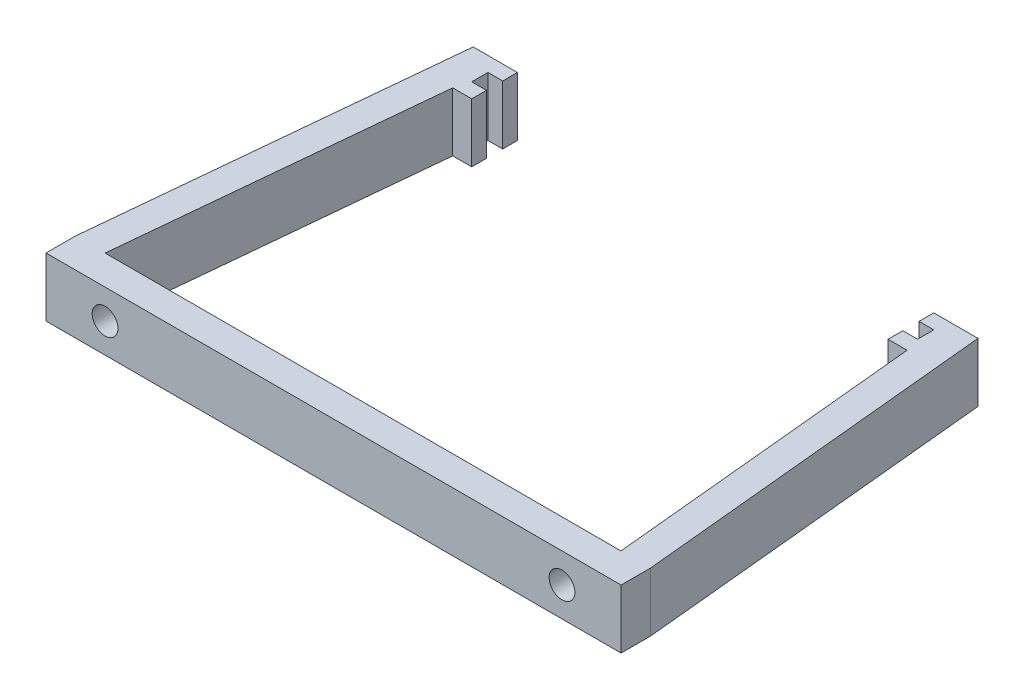
ISO-10303-21;
HEADER;
FILE_DESCRIPTION(('STEP AP214'),'2;1');
FILE_NAME('part.step','',(''),(''),'','','');
FILE_SCHEMA(('AUTOMOTIVE_DESIGN { 1 0 10303 214 1 1 1 1 }'));
ENDSEC;
DATA;
#1=APPLICATION_CONTEXT('core data for automotive mechanical design processes');
#2=APPLICATION_PROTOCOL_DEFINITION('international standard','automotive_design',2000,#1);
#3=PRODUCT_CONTEXT('',#1,'mechanical');
#4=PRODUCT('Part','Part','',(#3));
#5=PRODUCT_RELATED_PRODUCT_CATEGORY('part','',(#4));
#6=PRODUCT_DEFINITION_FORMATION('','',#4);
#7=PRODUCT_DEFINITION_CONTEXT('part definition',#1,'design');
#8=PRODUCT_DEFINITION('design','',#6,#7);
#9=PRODUCT_DEFINITION_SHAPE('','',#8);
#10=(LENGTH_UNIT() NAMED_UNIT(*) SI_UNIT(.MILLI.,.METRE.));
#11=(NAMED_UNIT(*) PLANE_ANGLE_UNIT() SI_UNIT($,.RADIAN.));
#12=(NAMED_UNIT(*) SI_UNIT($,.STERADIAN.) SOLID_ANGLE_UNIT());
#13=UNCERTAINTY_MEASURE_WITH_UNIT(LENGTH_MEASURE(1.E-05),#10,'distance_accuracy_value','');
#14=(GEOMETRIC_REPRESENTATION_CONTEXT(3) GLOBAL_UNCERTAINTY_ASSIGNED_CONTEXT((#13)) GLOBAL_UNIT_ASSIGNED_CONTEXT((#10,
#11,#12)) REPRESENTATION_CONTEXT('',''));
#15=CARTESIAN_POINT('',(0.,0.,0.));
#16=DIRECTION('',(0.,0.,1.));
#17=DIRECTION('',(1.,0.,0.));
#18=AXIS2_PLACEMENT_3D('',#15,#16,#17);
#19=CARTESIAN_POINT('',(0.,0.,4.));
#20=DIRECTION('',(0.,0.,1.));
#21=DIRECTION('',(1.,0.,0.));
#22=AXIS2_PLACEMENT_3D('',#19,#20,#21);
#23=PLANE('',#22);
#24=CARTESIAN_POINT('',(-31.,0.,4.));
#25=DIRECTION('',(0.,0.,1.));
#26=DIRECTION('',(1.,0.,0.));
#27=AXIS2_PLACEMENT_3D('',#24,#25,#26);
#28=CIRCLE('',#27,1.75);
#29=CARTESIAN_POINT('',(-29.25,0.,4.));
#30=VERTEX_POINT('',#29);
#31=EDGE_CURVE('E330',#30,#30,#28,.T.);
#32=ORIENTED_EDGE('',*,*,#31,.F.);
#33=EDGE_LOOP('',(#32));
#34=FACE_BOUND('',#33,.T.);
#35=DIRECTION('',(1.,0.,0.));
#36=VECTOR('',#35,1.);
#37=CARTESIAN_POINT('',(-35.,-4.,4.));
#38=LINE('',#37,#36);
#39=CARTESIAN_POINT('',(-39.0187452660254,-4.,4.));
#40=VERTEX_POINT('',#39);
#41=CARTESIAN_POINT('',(39.0187452660254,-4.,3.99999999999999));
#42=VERTEX_POINT('',#41);
#43=EDGE_CURVE('E11',#40,#42,#38,.T.);
#44=ORIENTED_EDGE('',*,*,#43,.T.);
#45=DIRECTION('',(0.,1.,0.));
#46=VECTOR('',#45,1.);
#47=CARTESIAN_POINT('',(39.0187452660254,-58.2789634628789,3.99999999999999));
#48=LINE('',#47,#46);
#49=CARTESIAN_POINT('',(39.0187452660254,4.,3.99999999999999));
#50=VERTEX_POINT('',#49);
#51=EDGE_CURVE('E233',#42,#50,#48,.T.);
#52=ORIENTED_EDGE('',*,*,#51,.T.);
#53=DIRECTION('',(-1.,0.,0.));
#54=VECTOR('',#53,1.);
#55=CARTESIAN_POINT('',(-35.,4.,4.));
#56=LINE('',#55,#54);
#57=CARTESIAN_POINT('',(-39.0187452660254,4.,4.));
#58=VERTEX_POINT('',#57);
#59=EDGE_CURVE('E41',#50,#58,#56,.T.);
#60=ORIENTED_EDGE('',*,*,#59,.T.);
#61=DIRECTION('',(0.,1.,0.));
#62=VECTOR('',#61,1.);
#63=CARTESIAN_POINT('',(-39.0187452660254,-58.2789634628789,4.));
#64=LINE('',#63,#62);
#65=EDGE_CURVE('E257',#40,#58,#64,.T.);
#66=ORIENTED_EDGE('',*,*,#65,.F.);
#67=EDGE_LOOP('',(#44,#52,#60,#66));
#68=FACE_BOUND('',#67,.T.);
#69=CARTESIAN_POINT('',(31.,0.,4.));
#70=DIRECTION('',(0.,0.,1.));
#71=DIRECTION('',(1.,0.,0.));
#72=AXIS2_PLACEMENT_3D('',#69,#70,#71);
#73=CIRCLE('',#72,1.75);
#74=CARTESIAN_POINT('',(32.75,0.,4.));
#75=VERTEX_POINT('',#74);
#76=EDGE_CURVE('E324',#75,#75,#73,.T.);
#77=ORIENTED_EDGE('',*,*,#76,.F.);
#78=EDGE_LOOP('',(#77));
#79=FACE_BOUND('',#78,.T.);
#80=ADVANCED_FACE('F32',(#34,#68,#79),#23,.T.);
#81=CARTESIAN_POINT('',(0.,0.,0.));
#82=DIRECTION('',(0.,0.,1.));
#83=DIRECTION('',(1.,0.,0.));
#84=AXIS2_PLACEMENT_3D('',#81,#82,#83);
#85=PLANE('',#84);
#86=DIRECTION('',(0.,1.,0.));
#87=VECTOR('',#86,1.);
#88=CARTESIAN_POINT('',(35.,4.,0.));
#89=LINE('',#88,#87);
#90=CARTESIAN_POINT('',(35.,-4.,0.));
#91=VERTEX_POINT('',#90);
#92=CARTESIAN_POINT('',(35.,4.,0.));
#93=VERTEX_POINT('',#92);
#94=EDGE_CURVE('E333',#91,#93,#89,.T.);
#95=ORIENTED_EDGE('',*,*,#94,.F.);
#96=DIRECTION('',(1.,0.,0.));
#97=VECTOR('',#96,1.);
#98=CARTESIAN_POINT('',(-35.,-4.,0.));
#99=LINE('',#98,#97);
#100=CARTESIAN_POINT('',(-35.,-4.,0.));
#101=VERTEX_POINT('',#100);
#102=EDGE_CURVE('E36',#101,#91,#99,.T.);
#103=ORIENTED_EDGE('',*,*,#102,.F.);
#104=DIRECTION('',(0.,-1.,0.));
#105=VECTOR('',#104,1.);
#106=CARTESIAN_POINT('',(-35.,4.,0.));
#107=LINE('',#106,#105);
#108=CARTESIAN_POINT('',(-35.,4.,0.));
#109=VERTEX_POINT('',#108);
#110=EDGE_CURVE('E49',#109,#101,#107,.T.);
#111=ORIENTED_EDGE('',*,*,#110,.F.);
#112=DIRECTION('',(-1.,0.,0.));
#113=VECTOR('',#112,1.);
#114=CARTESIAN_POINT('',(-35.,4.,0.));
#115=LINE('',#114,#113);
#116=EDGE_CURVE('E56',#93,#109,#115,.T.);
#117=ORIENTED_EDGE('',*,*,#116,.F.);
#118=EDGE_LOOP('',(#95,#103,#111,#117));
#119=FACE_BOUND('',#118,.T.);
#120=CARTESIAN_POINT('',(-31.,0.,0.));
#121=DIRECTION('',(0.,0.,1.));
#122=DIRECTION('',(1.,0.,0.));
#123=AXIS2_PLACEMENT_3D('',#120,#121,#122);
#124=CIRCLE('',#123,1.75);
#125=CARTESIAN_POINT('',(-29.25,0.,0.));
#126=VERTEX_POINT('',#125);
#127=EDGE_CURVE('E327',#126,#126,#124,.T.);
#128=ORIENTED_EDGE('',*,*,#127,.T.);
#129=EDGE_LOOP('',(#128));
#130=FACE_BOUND('',#129,.T.);
#131=CARTESIAN_POINT('',(31.,0.,0.));
#132=DIRECTION('',(0.,0.,1.));
#133=DIRECTION('',(1.,0.,0.));
#134=AXIS2_PLACEMENT_3D('',#131,#132,#133);
#135=CIRCLE('',#134,1.75);
#136=CARTESIAN_POINT('',(32.75,0.,0.));
#137=VERTEX_POINT('',#136);
#138=EDGE_CURVE('E323',#137,#137,#135,.T.);
#139=ORIENTED_EDGE('',*,*,#138,.T.);
#140=EDGE_LOOP('',(#139));
#141=FACE_BOUND('',#140,.T.);
#142=ADVANCED_FACE('F394',(#119,#130,#141),#85,.F.);
#143=CARTESIAN_POINT('',(-35.,4.,4.));
#144=DIRECTION('',(0.,-1.,0.));
#145=DIRECTION('',(0.,0.,-1.));
#146=AXIS2_PLACEMENT_3D('',#143,#144,#145);
#147=PLANE('',#146);
#148=ORIENTED_EDGE('',*,*,#116,.T.);
#149=DIRECTION('',(0.0964736109138817,0.,-0.995335542617281));
#150=VECTOR('',#149,1.);
#151=CARTESIAN_POINT('',(-30.8321941780672,4.,-43.));
#152=LINE('',#151,#150);
#153=CARTESIAN_POINT('',(-30.8321941780672,4.,-43.));
#154=VERTEX_POINT('',#153);
#155=EDGE_CURVE('E253',#109,#154,#152,.T.);
#156=ORIENTED_EDGE('',*,*,#155,.T.);
#157=DIRECTION('',(1.,0.,0.));
#158=VECTOR('',#157,1.);
#159=CARTESIAN_POINT('',(-28.25,4.,-43.));
#160=LINE('',#159,#158);
#161=CARTESIAN_POINT('',(-28.25,4.,-43.));
#162=VERTEX_POINT('',#161);
#163=EDGE_CURVE('E276',#154,#162,#160,.T.);
#164=ORIENTED_EDGE('',*,*,#163,.T.);
#165=DIRECTION('',(0.,0.,-1.));
#166=VECTOR('',#165,1.);
#167=CARTESIAN_POINT('',(-28.25,4.,-45.));
#168=LINE('',#167,#166);
#169=CARTESIAN_POINT('',(-28.25,4.,-45.));
#170=VERTEX_POINT('',#169);
#171=EDGE_CURVE('E279',#162,#170,#168,.T.);
#172=ORIENTED_EDGE('',*,*,#171,.T.);
#173=DIRECTION('',(-1.,0.,0.));
#174=VECTOR('',#173,1.);
#175=CARTESIAN_POINT('',(-30.25,4.,-45.));
#176=LINE('',#175,#174);
#177=CARTESIAN_POINT('',(-30.25,4.,-45.));
#178=VERTEX_POINT('',#177);
#179=EDGE_CURVE('E282',#170,#178,#176,.T.);
#180=ORIENTED_EDGE('',*,*,#179,.T.);
#181=DIRECTION('',(0.,0.,-1.));
#182=VECTOR('',#181,1.);
#183=CARTESIAN_POINT('',(-30.25,4.,-47.2));
#184=LINE('',#183,#182);
#185=CARTESIAN_POINT('',(-30.25,4.,-47.2));
#186=VERTEX_POINT('',#185);
#187=EDGE_CURVE('E285',#178,#186,#184,.T.);
#188=ORIENTED_EDGE('',*,*,#187,.T.);
#189=DIRECTION('',(1.,0.,0.));
#190=VECTOR('',#189,1.);
#191=CARTESIAN_POINT('',(-28.25,4.,-47.2));
#192=LINE('',#191,#190);
#193=CARTESIAN_POINT('',(-28.25,4.,-47.2));
#194=VERTEX_POINT('',#193);
#195=EDGE_CURVE('E288',#186,#194,#192,.T.);
#196=ORIENTED_EDGE('',*,*,#195,.T.);
#197=DIRECTION('',(0.,0.,-1.));
#198=VECTOR('',#197,1.);
#199=CARTESIAN_POINT('',(-28.25,4.,-49.2));
#200=LINE('',#199,#198);
#201=CARTESIAN_POINT('',(-28.25,4.,-49.2));
#202=VERTEX_POINT('',#201);
#203=EDGE_CURVE('E291',#194,#202,#200,.T.);
#204=ORIENTED_EDGE('',*,*,#203,.T.);
#205=DIRECTION('',(-1.,0.,0.));
#206=VECTOR('',#205,1.);
#207=CARTESIAN_POINT('',(-34.25,4.,-49.1999999999999));
#208=LINE('',#207,#206);
#209=CARTESIAN_POINT('',(-34.25,4.,-49.1999999999999));
#210=VERTEX_POINT('',#209);
#211=EDGE_CURVE('E294',#202,#210,#208,.T.);
#212=ORIENTED_EDGE('',*,*,#211,.T.);
#213=DIRECTION('',(-0.0964736109138816,0.,0.995335542617281));
#214=VECTOR('',#213,1.);
#215=CARTESIAN_POINT('',(-39.0187452660254,4.,0.));
#216=LINE('',#215,#214);
#217=CARTESIAN_POINT('',(-39.0187452660254,4.,0.));
#218=VERTEX_POINT('',#217);
#219=EDGE_CURVE('E297',#210,#218,#216,.T.);
#220=ORIENTED_EDGE('',*,*,#219,.T.);
#221=DIRECTION('',(0.,0.,1.));
#222=VECTOR('',#221,1.);
#223=CARTESIAN_POINT('',(-39.0187452660254,4.,0.));
#224=LINE('',#223,#222);
#225=EDGE_CURVE('E300',#218,#58,#224,.T.);
#226=ORIENTED_EDGE('',*,*,#225,.T.);
#227=ORIENTED_EDGE('',*,*,#59,.F.);
#228=DIRECTION('',(0.,0.,-1.));
#229=VECTOR('',#228,1.);
#230=CARTESIAN_POINT('',(39.0187452660254,4.,0.));
#231=LINE('',#230,#229);
#232=CARTESIAN_POINT('',(39.0187452660254,4.,0.));
#233=VERTEX_POINT('',#232);
#234=EDGE_CURVE('E189',#50,#233,#231,.T.);
#235=ORIENTED_EDGE('',*,*,#234,.T.);
#236=DIRECTION('',(-0.0964736109138818,0.,-0.995335542617281));
#237=VECTOR('',#236,1.);
#238=CARTESIAN_POINT('',(39.0187452660254,4.,0.));
#239=LINE('',#238,#237);
#240=CARTESIAN_POINT('',(34.25,4.,-49.2));
#241=VERTEX_POINT('',#240);
#242=EDGE_CURVE('E198',#233,#241,#239,.T.);
#243=ORIENTED_EDGE('',*,*,#242,.T.);
#244=DIRECTION('',(-1.,0.,0.));
#245=VECTOR('',#244,1.);
#246=CARTESIAN_POINT('',(34.25,4.,-49.2));
#247=LINE('',#246,#245);
#248=CARTESIAN_POINT('',(28.25,4.,-49.2));
#249=VERTEX_POINT('',#248);
#250=EDGE_CURVE('E204',#241,#249,#247,.T.);
#251=ORIENTED_EDGE('',*,*,#250,.T.);
#252=DIRECTION('',(0.,0.,1.));
#253=VECTOR('',#252,1.);
#254=CARTESIAN_POINT('',(28.25,4.,-49.2));
#255=LINE('',#254,#253);
#256=CARTESIAN_POINT('',(28.25,4.,-47.2));
#257=VERTEX_POINT('',#256);
#258=EDGE_CURVE('E213',#249,#257,#255,.T.);
#259=ORIENTED_EDGE('',*,*,#258,.T.);
#260=DIRECTION('',(1.,0.,0.));
#261=VECTOR('',#260,1.);
#262=CARTESIAN_POINT('',(28.25,4.,-47.2));
#263=LINE('',#262,#261);
#264=CARTESIAN_POINT('',(30.25,4.,-47.2));
#265=VERTEX_POINT('',#264);
#266=EDGE_CURVE('E216',#257,#265,#263,.T.);
#267=ORIENTED_EDGE('',*,*,#266,.T.);
#268=DIRECTION('',(0.,0.,1.));
#269=VECTOR('',#268,1.);
#270=CARTESIAN_POINT('',(30.25,4.,-47.2));
#271=LINE('',#270,#269);
#272=CARTESIAN_POINT('',(30.25,4.,-45.));
#273=VERTEX_POINT('',#272);
#274=EDGE_CURVE('E219',#265,#273,#271,.T.);
#275=ORIENTED_EDGE('',*,*,#274,.T.);
#276=DIRECTION('',(-1.,0.,0.));
#277=VECTOR('',#276,1.);
#278=CARTESIAN_POINT('',(30.25,4.,-45.));
#279=LINE('',#278,#277);
#280=CARTESIAN_POINT('',(28.25,4.,-45.));
#281=VERTEX_POINT('',#280);
#282=EDGE_CURVE('E222',#273,#281,#279,.T.);
#283=ORIENTED_EDGE('',*,*,#282,.T.);
#284=DIRECTION('',(0.,0.,1.));
#285=VECTOR('',#284,1.);
#286=CARTESIAN_POINT('',(28.25,4.,-45.));
#287=LINE('',#286,#285);
#288=CARTESIAN_POINT('',(28.25,4.,-43.));
#289=VERTEX_POINT('',#288);
#290=EDGE_CURVE('E225',#281,#289,#287,.T.);
#291=ORIENTED_EDGE('',*,*,#290,.T.);
#292=DIRECTION('',(1.,0.,0.));
#293=VECTOR('',#292,1.);
#294=CARTESIAN_POINT('',(28.25,4.,-43.));
#295=LINE('',#294,#293);
#296=CARTESIAN_POINT('',(30.8321941780672,4.,-43.));
#297=VERTEX_POINT('',#296);
#298=EDGE_CURVE('E228',#289,#297,#295,.T.);
#299=ORIENTED_EDGE('',*,*,#298,.T.);
#300=DIRECTION('',(0.0964736109138817,0.,0.995335542617281));
#301=VECTOR('',#300,1.);
#302=CARTESIAN_POINT('',(30.8321941780672,4.,-43.));
#303=LINE('',#302,#301);
#304=EDGE_CURVE('E195',#297,#93,#303,.T.);
#305=ORIENTED_EDGE('',*,*,#304,.T.);
#306=EDGE_LOOP('',(#148,#156,#164,#172,#180,#188,#196,#204,#212,#220,#226,#227,#235,#243,#251,
#259,#267,#275,#283,#291,#299,#305));
#307=FACE_BOUND('',#306,.T.);
#308=ADVANCED_FACE('F34',(#307),#147,.F.);
#309=CARTESIAN_POINT('',(-35.,-4.,4.));
#310=DIRECTION('',(0.,1.,0.));
#311=DIRECTION('',(0.,0.,1.));
#312=AXIS2_PLACEMENT_3D('',#309,#310,#311);
#313=PLANE('',#312);
#314=ORIENTED_EDGE('',*,*,#102,.T.);
#315=DIRECTION('',(-0.0964736109138817,0.,-0.995335542617281));
#316=VECTOR('',#315,1.);
#317=CARTESIAN_POINT('',(30.8321941780672,-4.,-43.));
#318=LINE('',#317,#316);
#319=CARTESIAN_POINT('',(30.8321941780672,-4.,-43.));
#320=VERTEX_POINT('',#319);
#321=EDGE_CURVE('E343',#91,#320,#318,.T.);
#322=ORIENTED_EDGE('',*,*,#321,.T.);
#323=DIRECTION('',(-1.,0.,0.));
#324=VECTOR('',#323,1.);
#325=CARTESIAN_POINT('',(28.25,-4.,-43.));
#326=LINE('',#325,#324);
#327=CARTESIAN_POINT('',(28.25,-4.,-43.));
#328=VERTEX_POINT('',#327);
#329=EDGE_CURVE('E349',#320,#328,#326,.T.);
#330=ORIENTED_EDGE('',*,*,#329,.T.);
#331=DIRECTION('',(0.,0.,-1.));
#332=VECTOR('',#331,1.);
#333=CARTESIAN_POINT('',(28.25,-4.,-45.));
#334=LINE('',#333,#332);
#335=CARTESIAN_POINT('',(28.25,-4.,-45.));
#336=VERTEX_POINT('',#335);
#337=EDGE_CURVE('E350',#328,#336,#334,.T.);
#338=ORIENTED_EDGE('',*,*,#337,.T.);
#339=DIRECTION('',(1.,0.,0.));
#340=VECTOR('',#339,1.);
#341=CARTESIAN_POINT('',(30.25,-4.,-45.));
#342=LINE('',#341,#340);
#343=CARTESIAN_POINT('',(30.25,-4.,-45.));
#344=VERTEX_POINT('',#343);
#345=EDGE_CURVE('E354',#336,#344,#342,.T.);
#346=ORIENTED_EDGE('',*,*,#345,.T.);
#347=DIRECTION('',(0.,0.,-1.));
#348=VECTOR('',#347,1.);
#349=CARTESIAN_POINT('',(30.25,-4.,-47.2));
#350=LINE('',#349,#348);
#351=CARTESIAN_POINT('',(30.25,-4.,-47.2));
#352=VERTEX_POINT('',#351);
#353=EDGE_CURVE('E356',#344,#352,#350,.T.);
#354=ORIENTED_EDGE('',*,*,#353,.T.);
#355=DIRECTION('',(-1.,0.,0.));
#356=VECTOR('',#355,1.);
#357=CARTESIAN_POINT('',(28.25,-4.,-47.2));
#358=LINE('',#357,#356);
#359=CARTESIAN_POINT('',(28.25,-4.,-47.2));
#360=VERTEX_POINT('',#359);
#361=EDGE_CURVE('E358',#352,#360,#358,.T.);
#362=ORIENTED_EDGE('',*,*,#361,.T.);
#363=DIRECTION('',(0.,0.,-1.));
#364=VECTOR('',#363,1.);
#365=CARTESIAN_POINT('',(28.25,-4.,-49.2));
#366=LINE('',#365,#364);
#367=CARTESIAN_POINT('',(28.25,-4.,-49.2));
#368=VERTEX_POINT('',#367);
#369=EDGE_CURVE('E360',#360,#368,#366,.T.);
#370=ORIENTED_EDGE('',*,*,#369,.T.);
#371=DIRECTION('',(1.,0.,0.));
#372=VECTOR('',#371,1.);
#373=CARTESIAN_POINT('',(34.25,-4.,-49.2));
#374=LINE('',#373,#372);
#375=CARTESIAN_POINT('',(34.25,-4.,-49.2));
#376=VERTEX_POINT('',#375);
#377=EDGE_CURVE('E235',#368,#376,#374,.T.);
#378=ORIENTED_EDGE('',*,*,#377,.T.);
#379=DIRECTION('',(0.0964736109138819,0.,0.995335542617281));
#380=VECTOR('',#379,1.);
#381=CARTESIAN_POINT('',(39.0187452660254,-4.,0.));
#382=LINE('',#381,#380);
#383=CARTESIAN_POINT('',(39.0187452660254,-4.,0.));
#384=VERTEX_POINT('',#383);
#385=EDGE_CURVE('E251',#376,#384,#382,.T.);
#386=ORIENTED_EDGE('',*,*,#385,.T.);
#387=DIRECTION('',(0.,0.,1.));
#388=VECTOR('',#387,1.);
#389=CARTESIAN_POINT('',(39.0187452660254,-4.,0.));
#390=LINE('',#389,#388);
#391=EDGE_CURVE('E191',#384,#42,#390,.T.);
#392=ORIENTED_EDGE('',*,*,#391,.T.);
#393=ORIENTED_EDGE('',*,*,#43,.F.);
#394=DIRECTION('',(0.,0.,-1.));
#395=VECTOR('',#394,1.);
#396=CARTESIAN_POINT('',(-39.0187452660254,-4.,0.));
#397=LINE('',#396,#395);
#398=CARTESIAN_POINT('',(-39.0187452660254,-4.,0.));
#399=VERTEX_POINT('',#398);
#400=EDGE_CURVE('E269',#40,#399,#397,.T.);
#401=ORIENTED_EDGE('',*,*,#400,.T.);
#402=DIRECTION('',(0.0964736109138816,0.,-0.995335542617281));
#403=VECTOR('',#402,1.);
#404=CARTESIAN_POINT('',(-39.0187452660254,-4.,0.));
#405=LINE('',#404,#403);
#406=CARTESIAN_POINT('',(-34.25,-4.,-49.1999999999999));
#407=VERTEX_POINT('',#406);
#408=EDGE_CURVE('E267',#399,#407,#405,.T.);
#409=ORIENTED_EDGE('',*,*,#408,.T.);
#410=DIRECTION('',(1.,0.,0.));
#411=VECTOR('',#410,1.);
#412=CARTESIAN_POINT('',(-34.25,-4.,-49.1999999999999));
#413=LINE('',#412,#411);
#414=CARTESIAN_POINT('',(-28.25,-4.,-49.2));
#415=VERTEX_POINT('',#414);
#416=EDGE_CURVE('E265',#407,#415,#413,.T.);
#417=ORIENTED_EDGE('',*,*,#416,.T.);
#418=DIRECTION('',(0.,0.,1.));
#419=VECTOR('',#418,1.);
#420=CARTESIAN_POINT('',(-28.25,-4.,-49.2));
#421=LINE('',#420,#419);
#422=CARTESIAN_POINT('',(-28.25,-4.,-47.2));
#423=VERTEX_POINT('',#422);
#424=EDGE_CURVE('E263',#415,#423,#421,.T.);
#425=ORIENTED_EDGE('',*,*,#424,.T.);
#426=DIRECTION('',(-1.,0.,0.));
#427=VECTOR('',#426,1.);
#428=CARTESIAN_POINT('',(-28.25,-4.,-47.2));
#429=LINE('',#428,#427);
#430=CARTESIAN_POINT('',(-30.25,-4.,-47.2));
#431=VERTEX_POINT('',#430);
#432=EDGE_CURVE('E261',#423,#431,#429,.T.);
#433=ORIENTED_EDGE('',*,*,#432,.T.);
#434=DIRECTION('',(0.,0.,1.));
#435=VECTOR('',#434,1.);
#436=CARTESIAN_POINT('',(-30.25,-4.,-47.2));
#437=LINE('',#436,#435);
#438=CARTESIAN_POINT('',(-30.25,-4.,-45.));
#439=VERTEX_POINT('',#438);
#440=EDGE_CURVE('E259',#431,#439,#437,.T.);
#441=ORIENTED_EDGE('',*,*,#440,.T.);
#442=DIRECTION('',(1.,0.,0.));
#443=VECTOR('',#442,1.);
#444=CARTESIAN_POINT('',(-30.25,-4.,-45.));
#445=LINE('',#444,#443);
#446=CARTESIAN_POINT('',(-28.25,-4.,-45.));
#447=VERTEX_POINT('',#446);
#448=EDGE_CURVE('E256',#439,#447,#445,.T.);
#449=ORIENTED_EDGE('',*,*,#448,.T.);
#450=DIRECTION('',(0.,0.,1.));
#451=VECTOR('',#450,1.);
#452=CARTESIAN_POINT('',(-28.25,-4.,-45.));
#453=LINE('',#452,#451);
#454=CARTESIAN_POINT('',(-28.25,-4.,-43.));
#455=VERTEX_POINT('',#454);
#456=EDGE_CURVE('E254',#447,#455,#453,.T.);
#457=ORIENTED_EDGE('',*,*,#456,.T.);
#458=DIRECTION('',(-1.,0.,0.));
#459=VECTOR('',#458,1.);
#460=CARTESIAN_POINT('',(-28.25,-4.,-43.));
#461=LINE('',#460,#459);
#462=CARTESIAN_POINT('',(-30.8321941780672,-4.,-43.));
#463=VERTEX_POINT('',#462);
#464=EDGE_CURVE('E273',#455,#463,#461,.T.);
#465=ORIENTED_EDGE('',*,*,#464,.T.);
#466=DIRECTION('',(-0.0964736109138817,0.,0.995335542617281));
#467=VECTOR('',#466,1.);
#468=CARTESIAN_POINT('',(-30.8321941780672,-4.,-43.));
#469=LINE('',#468,#467);
#470=EDGE_CURVE('E271',#463,#101,#469,.T.);
#471=ORIENTED_EDGE('',*,*,#470,.T.);
#472=EDGE_LOOP('',(#314,#322,#330,#338,#346,#354,#362,#370,#378,#386,#392,#393,#401,#409,#417,
#425,#433,#441,#449,#457,#465,#471));
#473=FACE_BOUND('',#472,.T.);
#474=ADVANCED_FACE('F342',(#473),#313,.F.);
#475=CARTESIAN_POINT('',(-31.,0.,4.));
#476=DIRECTION('',(0.,0.,-1.));
#477=DIRECTION('',(-1.,0.,0.));
#478=AXIS2_PLACEMENT_3D('',#475,#476,#477);
#479=CYLINDRICAL_SURFACE('',#478,1.75);
#480=ORIENTED_EDGE('',*,*,#31,.T.);
#481=EDGE_LOOP('',(#480));
#482=FACE_BOUND('',#481,.T.);
#483=ORIENTED_EDGE('',*,*,#127,.F.);
#484=EDGE_LOOP('',(#483));
#485=FACE_BOUND('',#484,.T.);
#486=ADVANCED_FACE('F405',(#482,#485),#479,.F.);
#487=CARTESIAN_POINT('',(31.,0.,4.));
#488=DIRECTION('',(0.,0.,-1.));
#489=DIRECTION('',(-1.,0.,0.));
#490=AXIS2_PLACEMENT_3D('',#487,#488,#489);
#491=CYLINDRICAL_SURFACE('',#490,1.75);
#492=ORIENTED_EDGE('',*,*,#76,.T.);
#493=EDGE_LOOP('',(#492));
#494=FACE_BOUND('',#493,.T.);
#495=ORIENTED_EDGE('',*,*,#138,.F.);
#496=EDGE_LOOP('',(#495));
#497=FACE_BOUND('',#496,.T.);
#498=ADVANCED_FACE('F402',(#494,#497),#491,.F.);
#499=CARTESIAN_POINT('',(-30.8321941780672,-58.2789634628789,-43.));
#500=DIRECTION('',(0.995335542617281,0.,0.0964736109138817));
#501=DIRECTION('',(0.0964736109138817,0.,-0.995335542617281));
#502=AXIS2_PLACEMENT_3D('',#499,#500,#501);
#503=PLANE('',#502);
#504=ORIENTED_EDGE('',*,*,#470,.F.);
#505=DIRECTION('',(0.,1.,0.));
#506=VECTOR('',#505,1.);
#507=CARTESIAN_POINT('',(-30.8321941780672,-58.2789634628789,-43.));
#508=LINE('',#507,#506);
#509=EDGE_CURVE('E302',#463,#154,#508,.T.);
#510=ORIENTED_EDGE('',*,*,#509,.T.);
#511=ORIENTED_EDGE('',*,*,#155,.F.);
#512=ORIENTED_EDGE('',*,*,#110,.T.);
#513=EDGE_LOOP('',(#504,#510,#511,#512));
#514=FACE_BOUND('',#513,.T.);
#515=ADVANCED_FACE('F404',(#514),#503,.T.);
#516=CARTESIAN_POINT('',(-39.0187452660254,-58.2789634628789,0.));
#517=DIRECTION('',(-1.,0.,0.));
#518=DIRECTION('',(0.,0.,1.));
#519=AXIS2_PLACEMENT_3D('',#516,#517,#518);
#520=PLANE('',#519);
#521=ORIENTED_EDGE('',*,*,#400,.F.);
#522=ORIENTED_EDGE('',*,*,#65,.T.);
#523=ORIENTED_EDGE('',*,*,#225,.F.);
#524=DIRECTION('',(0.,1.,0.));
#525=VECTOR('',#524,1.);
#526=CARTESIAN_POINT('',(-39.0187452660254,-58.2789634628789,0.));
#527=LINE('',#526,#525);
#528=EDGE_CURVE('E305',#399,#218,#527,.T.);
#529=ORIENTED_EDGE('',*,*,#528,.F.);
#530=EDGE_LOOP('',(#521,#522,#523,#529));
#531=FACE_BOUND('',#530,.T.);
#532=ADVANCED_FACE('F412',(#531),#520,.T.);
#533=CARTESIAN_POINT('',(-39.0187452660254,-58.2789634628789,0.));
#534=DIRECTION('',(-0.995335542617281,0.,-0.0964736109138816));
#535=DIRECTION('',(-0.0964736109138816,0.,0.995335542617281));
#536=AXIS2_PLACEMENT_3D('',#533,#534,#535);
#537=PLANE('',#536);
#538=ORIENTED_EDGE('',*,*,#408,.F.);
#539=ORIENTED_EDGE('',*,*,#528,.T.);
#540=ORIENTED_EDGE('',*,*,#219,.F.);
#541=DIRECTION('',(0.,1.,0.));
#542=VECTOR('',#541,1.);
#543=CARTESIAN_POINT('',(-34.25,-58.2789634628789,-49.1999999999999));
#544=LINE('',#543,#542);
#545=EDGE_CURVE('E307',#407,#210,#544,.T.);
#546=ORIENTED_EDGE('',*,*,#545,.F.);
#547=EDGE_LOOP('',(#538,#539,#540,#546));
#548=FACE_BOUND('',#547,.T.);
#549=ADVANCED_FACE('F482',(#548),#537,.T.);
#550=CARTESIAN_POINT('',(-34.25,-58.2789634628789,-49.1999999999999));
#551=DIRECTION('',(0.,0.,-1.));
#552=DIRECTION('',(-1.,0.,0.));
#553=AXIS2_PLACEMENT_3D('',#550,#551,#552);
#554=PLANE('',#553);
#555=ORIENTED_EDGE('',*,*,#416,.F.);
#556=ORIENTED_EDGE('',*,*,#545,.T.);
#557=ORIENTED_EDGE('',*,*,#211,.F.);
#558=DIRECTION('',(0.,1.,0.));
#559=VECTOR('',#558,1.);
#560=CARTESIAN_POINT('',(-28.25,-58.2789634628789,-49.2));
#561=LINE('',#560,#559);
#562=EDGE_CURVE('E309',#415,#202,#561,.T.);
#563=ORIENTED_EDGE('',*,*,#562,.F.);
#564=EDGE_LOOP('',(#555,#556,#557,#563));
#565=FACE_BOUND('',#564,.T.);
#566=ADVANCED_FACE('F491',(#565),#554,.T.);
#567=CARTESIAN_POINT('',(-28.25,-58.2789634628789,-49.2));
#568=DIRECTION('',(1.,0.,0.));
#569=DIRECTION('',(0.,0.,-1.));
#570=AXIS2_PLACEMENT_3D('',#567,#568,#569);
#571=PLANE('',#570);
#572=ORIENTED_EDGE('',*,*,#424,.F.);
#573=ORIENTED_EDGE('',*,*,#562,.T.);
#574=ORIENTED_EDGE('',*,*,#203,.F.);
#575=DIRECTION('',(0.,1.,0.));
#576=VECTOR('',#575,1.);
#577=CARTESIAN_POINT('',(-28.25,-58.2789634628789,-47.2));
#578=LINE('',#577,#576);
#579=EDGE_CURVE('E311',#423,#194,#578,.T.);
#580=ORIENTED_EDGE('',*,*,#579,.F.);
#581=EDGE_LOOP('',(#572,#573,#574,#580));
#582=FACE_BOUND('',#581,.T.);
#583=ADVANCED_FACE('F500',(#582),#571,.T.);
#584=CARTESIAN_POINT('',(-28.25,-58.2789634628789,-47.2));
#585=DIRECTION('',(0.,0.,1.));
#586=DIRECTION('',(1.,0.,0.));
#587=AXIS2_PLACEMENT_3D('',#584,#585,#586);
#588=PLANE('',#587);
#589=ORIENTED_EDGE('',*,*,#432,.F.);
#590=ORIENTED_EDGE('',*,*,#579,.T.);
#591=ORIENTED_EDGE('',*,*,#195,.F.);
#592=DIRECTION('',(0.,1.,0.));
#593=VECTOR('',#592,1.);
#594=CARTESIAN_POINT('',(-30.25,-58.2789634628789,-47.2));
#595=LINE('',#594,#593);
#596=EDGE_CURVE('E313',#431,#186,#595,.T.);
#597=ORIENTED_EDGE('',*,*,#596,.F.);
#598=EDGE_LOOP('',(#589,#590,#591,#597));
#599=FACE_BOUND('',#598,.T.);
#600=ADVANCED_FACE('F509',(#599),#588,.T.);
#601=CARTESIAN_POINT('',(-30.25,-58.2789634628789,-47.2));
#602=DIRECTION('',(1.,0.,0.));
#603=DIRECTION('',(0.,0.,-1.));
#604=AXIS2_PLACEMENT_3D('',#601,#602,#603);
#605=PLANE('',#604);
#606=ORIENTED_EDGE('',*,*,#440,.F.);
#607=ORIENTED_EDGE('',*,*,#596,.T.);
#608=ORIENTED_EDGE('',*,*,#187,.F.);
#609=DIRECTION('',(0.,1.,0.));
#610=VECTOR('',#609,1.);
#611=CARTESIAN_POINT('',(-30.25,-58.2789634628789,-45.));
#612=LINE('',#611,#610);
#613=EDGE_CURVE('E315',#439,#178,#612,.T.);
#614=ORIENTED_EDGE('',*,*,#613,.F.);
#615=EDGE_LOOP('',(#606,#607,#608,#614));
#616=FACE_BOUND('',#615,.T.);
#617=ADVANCED_FACE('F518',(#616),#605,.T.);
#618=CARTESIAN_POINT('',(-30.25,-58.2789634628789,-45.));
#619=DIRECTION('',(0.,0.,-1.));
#620=DIRECTION('',(-1.,0.,0.));
#621=AXIS2_PLACEMENT_3D('',#618,#619,#620);
#622=PLANE('',#621);
#623=ORIENTED_EDGE('',*,*,#448,.F.);
#624=ORIENTED_EDGE('',*,*,#613,.T.);
#625=ORIENTED_EDGE('',*,*,#179,.F.);
#626=DIRECTION('',(0.,1.,0.));
#627=VECTOR('',#626,1.);
#628=CARTESIAN_POINT('',(-28.25,-58.2789634628789,-45.));
#629=LINE('',#628,#627);
#630=EDGE_CURVE('E317',#447,#170,#629,.T.);
#631=ORIENTED_EDGE('',*,*,#630,.F.);
#632=EDGE_LOOP('',(#623,#624,#625,#631));
#633=FACE_BOUND('',#632,.T.);
#634=ADVANCED_FACE('F527',(#633),#622,.T.);
#635=CARTESIAN_POINT('',(-28.25,-58.2789634628789,-45.));
#636=DIRECTION('',(1.,0.,0.));
#637=DIRECTION('',(0.,0.,-1.));
#638=AXIS2_PLACEMENT_3D('',#635,#636,#637);
#639=PLANE('',#638);
#640=ORIENTED_EDGE('',*,*,#456,.F.);
#641=ORIENTED_EDGE('',*,*,#630,.T.);
#642=ORIENTED_EDGE('',*,*,#171,.F.);
#643=DIRECTION('',(0.,1.,0.));
#644=VECTOR('',#643,1.);
#645=CARTESIAN_POINT('',(-28.25,-58.2789634628789,-43.));
#646=LINE('',#645,#644);
#647=EDGE_CURVE('E319',#455,#162,#646,.T.);
#648=ORIENTED_EDGE('',*,*,#647,.F.);
#649=EDGE_LOOP('',(#640,#641,#642,#648));
#650=FACE_BOUND('',#649,.T.);
#651=ADVANCED_FACE('F536',(#650),#639,.T.);
#652=CARTESIAN_POINT('',(-28.25,-58.2789634628789,-43.));
#653=DIRECTION('',(0.,0.,1.));
#654=DIRECTION('',(1.,0.,0.));
#655=AXIS2_PLACEMENT_3D('',#652,#653,#654);
#656=PLANE('',#655);
#657=ORIENTED_EDGE('',*,*,#464,.F.);
#658=ORIENTED_EDGE('',*,*,#647,.T.);
#659=ORIENTED_EDGE('',*,*,#163,.F.);
#660=ORIENTED_EDGE('',*,*,#509,.F.);
#661=EDGE_LOOP('',(#657,#658,#659,#660));
#662=FACE_BOUND('',#661,.T.);
#663=ADVANCED_FACE('F545',(#662),#656,.T.);
#664=CARTESIAN_POINT('',(39.0187452660254,-58.2789634628789,0.));
#665=DIRECTION('',(1.,0.,0.));
#666=DIRECTION('',(0.,0.,-1.));
#667=AXIS2_PLACEMENT_3D('',#664,#665,#666);
#668=PLANE('',#667);
#669=ORIENTED_EDGE('',*,*,#391,.F.);
#670=DIRECTION('',(0.,1.,0.));
#671=VECTOR('',#670,1.);
#672=CARTESIAN_POINT('',(39.0187452660254,-58.2789634628789,0.));
#673=LINE('',#672,#671);
#674=EDGE_CURVE('E184',#384,#233,#673,.T.);
#675=ORIENTED_EDGE('',*,*,#674,.T.);
#676=ORIENTED_EDGE('',*,*,#234,.F.);
#677=ORIENTED_EDGE('',*,*,#51,.F.);
#678=EDGE_LOOP('',(#669,#675,#676,#677));
#679=FACE_BOUND('',#678,.T.);
#680=ADVANCED_FACE('F186',(#679),#668,.T.);
#681=CARTESIAN_POINT('',(30.8321941780672,-58.2789634628789,-43.));
#682=DIRECTION('',(-0.995335542617281,0.,0.0964736109138817));
#683=DIRECTION('',(0.0964736109138817,0.,0.995335542617281));
#684=AXIS2_PLACEMENT_3D('',#681,#682,#683);
#685=PLANE('',#684);
#686=ORIENTED_EDGE('',*,*,#321,.F.);
#687=ORIENTED_EDGE('',*,*,#94,.T.);
#688=ORIENTED_EDGE('',*,*,#304,.F.);
#689=DIRECTION('',(0.,1.,0.));
#690=VECTOR('',#689,1.);
#691=CARTESIAN_POINT('',(30.8321941780672,-58.2789634628789,-43.));
#692=LINE('',#691,#690);
#693=EDGE_CURVE('E236',#320,#297,#692,.T.);
#694=ORIENTED_EDGE('',*,*,#693,.F.);
#695=EDGE_LOOP('',(#686,#687,#688,#694));
#696=FACE_BOUND('',#695,.T.);
#697=ADVANCED_FACE('F347',(#696),#685,.T.);
#698=CARTESIAN_POINT('',(28.25,-58.2789634628789,-43.));
#699=DIRECTION('',(0.,0.,1.));
#700=DIRECTION('',(1.,0.,0.));
#701=AXIS2_PLACEMENT_3D('',#698,#699,#700);
#702=PLANE('',#701);
#703=ORIENTED_EDGE('',*,*,#329,.F.);
#704=ORIENTED_EDGE('',*,*,#693,.T.);
#705=ORIENTED_EDGE('',*,*,#298,.F.);
#706=DIRECTION('',(0.,1.,0.));
#707=VECTOR('',#706,1.);
#708=CARTESIAN_POINT('',(28.25,-58.2789634628789,-43.));
#709=LINE('',#708,#707);
#710=EDGE_CURVE('E238',#328,#289,#709,.T.);
#711=ORIENTED_EDGE('',*,*,#710,.F.);
#712=EDGE_LOOP('',(#703,#704,#705,#711));
#713=FACE_BOUND('',#712,.T.);
#714=ADVANCED_FACE('F393',(#713),#702,.T.);
#715=CARTESIAN_POINT('',(28.25,-58.2789634628789,-45.));
#716=DIRECTION('',(-1.,0.,0.));
#717=DIRECTION('',(0.,0.,1.));
#718=AXIS2_PLACEMENT_3D('',#715,#716,#717);
#719=PLANE('',#718);
#720=ORIENTED_EDGE('',*,*,#337,.F.);
#721=ORIENTED_EDGE('',*,*,#710,.T.);
#722=ORIENTED_EDGE('',*,*,#290,.F.);
#723=DIRECTION('',(0.,1.,0.));
#724=VECTOR('',#723,1.);
#725=CARTESIAN_POINT('',(28.25,-58.2789634628789,-45.));
#726=LINE('',#725,#724);
#727=EDGE_CURVE('E240',#336,#281,#726,.T.);
#728=ORIENTED_EDGE('',*,*,#727,.F.);
#729=EDGE_LOOP('',(#720,#721,#722,#728));
#730=FACE_BOUND('',#729,.T.);
#731=ADVANCED_FACE('F389',(#730),#719,.T.);
#732=CARTESIAN_POINT('',(30.25,-58.2789634628789,-45.));
#733=DIRECTION('',(0.,0.,-1.));
#734=DIRECTION('',(-1.,0.,0.));
#735=AXIS2_PLACEMENT_3D('',#732,#733,#734);
#736=PLANE('',#735);
#737=ORIENTED_EDGE('',*,*,#345,.F.);
#738=ORIENTED_EDGE('',*,*,#727,.T.);
#739=ORIENTED_EDGE('',*,*,#282,.F.);
#740=DIRECTION('',(0.,1.,0.));
#741=VECTOR('',#740,1.);
#742=CARTESIAN_POINT('',(30.25,-58.2789634628789,-45.));
#743=LINE('',#742,#741);
#744=EDGE_CURVE('E242',#344,#273,#743,.T.);
#745=ORIENTED_EDGE('',*,*,#744,.F.);
#746=EDGE_LOOP('',(#737,#738,#739,#745));
#747=FACE_BOUND('',#746,.T.);
#748=ADVANCED_FACE('F385',(#747),#736,.T.);
#749=CARTESIAN_POINT('',(30.25,-58.2789634628789,-47.2));
#750=DIRECTION('',(-1.,0.,0.));
#751=DIRECTION('',(0.,0.,1.));
#752=AXIS2_PLACEMENT_3D('',#749,#750,#751);
#753=PLANE('',#752);
#754=ORIENTED_EDGE('',*,*,#353,.F.);
#755=ORIENTED_EDGE('',*,*,#744,.T.);
#756=ORIENTED_EDGE('',*,*,#274,.F.);
#757=DIRECTION('',(0.,1.,0.));
#758=VECTOR('',#757,1.);
#759=CARTESIAN_POINT('',(30.25,-58.2789634628789,-47.2));
#760=LINE('',#759,#758);
#761=EDGE_CURVE('E244',#352,#265,#760,.T.);
#762=ORIENTED_EDGE('',*,*,#761,.F.);
#763=EDGE_LOOP('',(#754,#755,#756,#762));
#764=FACE_BOUND('',#763,.T.);
#765=ADVANCED_FACE('F379',(#764),#753,.T.);
#766=CARTESIAN_POINT('',(28.25,-58.2789634628789,-47.2));
#767=DIRECTION('',(0.,0.,1.));
#768=DIRECTION('',(1.,0.,0.));
#769=AXIS2_PLACEMENT_3D('',#766,#767,#768);
#770=PLANE('',#769);
#771=ORIENTED_EDGE('',*,*,#361,.F.);
#772=ORIENTED_EDGE('',*,*,#761,.T.);
#773=ORIENTED_EDGE('',*,*,#266,.F.);
#774=DIRECTION('',(0.,1.,0.));
#775=VECTOR('',#774,1.);
#776=CARTESIAN_POINT('',(28.25,-58.2789634628789,-47.2));
#777=LINE('',#776,#775);
#778=EDGE_CURVE('E246',#360,#257,#777,.T.);
#779=ORIENTED_EDGE('',*,*,#778,.F.);
#780=EDGE_LOOP('',(#771,#772,#773,#779));
#781=FACE_BOUND('',#780,.T.);
#782=ADVANCED_FACE('F374',(#781),#770,.T.);
#783=CARTESIAN_POINT('',(28.25,-58.2789634628789,-49.2));
#784=DIRECTION('',(-1.,0.,0.));
#785=DIRECTION('',(0.,0.,1.));
#786=AXIS2_PLACEMENT_3D('',#783,#784,#785);
#787=PLANE('',#786);
#788=ORIENTED_EDGE('',*,*,#369,.F.);
#789=ORIENTED_EDGE('',*,*,#778,.T.);
#790=ORIENTED_EDGE('',*,*,#258,.F.);
#791=DIRECTION('',(0.,1.,0.));
#792=VECTOR('',#791,1.);
#793=CARTESIAN_POINT('',(28.25,-58.2789634628789,-49.2));
#794=LINE('',#793,#792);
#795=EDGE_CURVE('E248',#368,#249,#794,.T.);
#796=ORIENTED_EDGE('',*,*,#795,.F.);
#797=EDGE_LOOP('',(#788,#789,#790,#796));
#798=FACE_BOUND('',#797,.T.);
#799=ADVANCED_FACE('F370',(#798),#787,.T.);
#800=CARTESIAN_POINT('',(34.25,-58.2789634628789,-49.2));
#801=DIRECTION('',(0.,0.,-1.));
#802=DIRECTION('',(-1.,0.,0.));
#803=AXIS2_PLACEMENT_3D('',#800,#801,#802);
#804=PLANE('',#803);
#805=ORIENTED_EDGE('',*,*,#377,.F.);
#806=ORIENTED_EDGE('',*,*,#795,.T.);
#807=ORIENTED_EDGE('',*,*,#250,.F.);
#808=DIRECTION('',(0.,1.,0.));
#809=VECTOR('',#808,1.);
#810=CARTESIAN_POINT('',(34.25,-58.2789634628789,-49.2));
#811=LINE('',#810,#809);
#812=EDGE_CURVE('E194',#376,#241,#811,.T.);
#813=ORIENTED_EDGE('',*,*,#812,.F.);
#814=EDGE_LOOP('',(#805,#806,#807,#813));
#815=FACE_BOUND('',#814,.T.);
#816=ADVANCED_FACE('F366',(#815),#804,.T.);
#817=CARTESIAN_POINT('',(39.0187452660254,-58.2789634628789,0.));
#818=DIRECTION('',(0.995335542617281,0.,-0.0964736109138818));
#819=DIRECTION('',(-0.0964736109138819,0.,-0.995335542617281));
#820=AXIS2_PLACEMENT_3D('',#817,#818,#819);
#821=PLANE('',#820);
#822=ORIENTED_EDGE('',*,*,#385,.F.);
#823=ORIENTED_EDGE('',*,*,#812,.T.);
#824=ORIENTED_EDGE('',*,*,#242,.F.);
#825=ORIENTED_EDGE('',*,*,#674,.F.);
#826=EDGE_LOOP('',(#822,#823,#824,#825));
#827=FACE_BOUND('',#826,.T.);
#828=ADVANCED_FACE('F199',(#827),#821,.T.);
#829=CLOSED_SHELL('',(#80,#142,#308,#474,#486,#498,#515,#532,#549,#566,#583,#600,#617,#634,#651,
#663,#680,#697,#714,#731,#748,#765,#782,#799,#816,#828));
#830=MANIFOLD_SOLID_BREP('B2',#829);
#831=ADVANCED_BREP_SHAPE_REPRESENTATION('',(#18,#830),#14);
#832=SHAPE_DEFINITION_REPRESENTATION(#9,#831);
ENDSEC;
END-ISO-10303-21;
